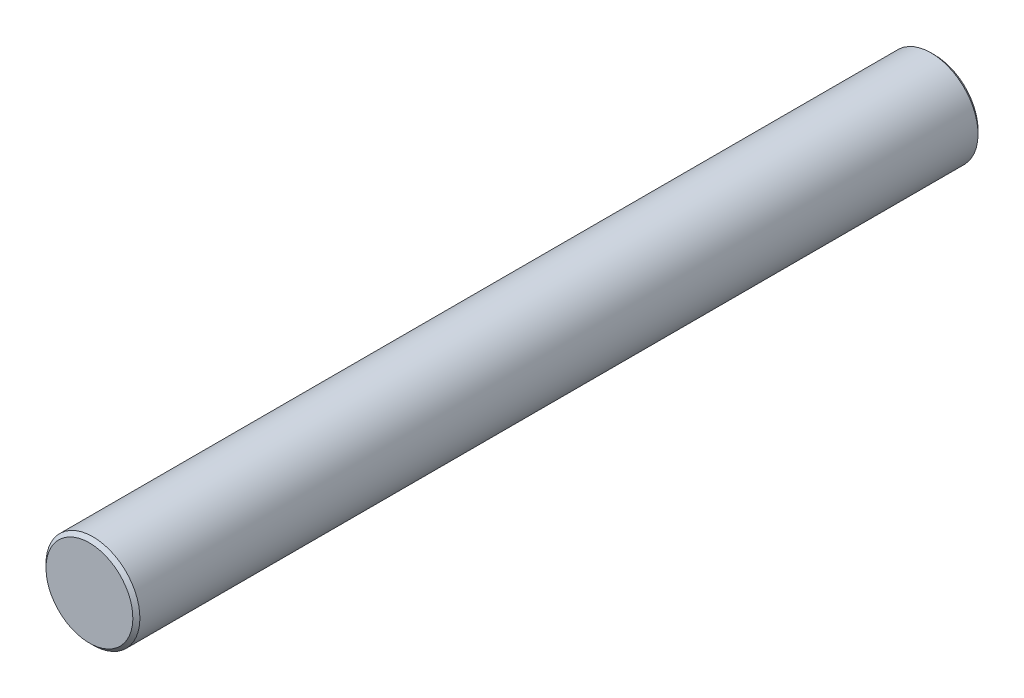
ISO-10303-21;
HEADER;
FILE_DESCRIPTION(('STEP AP214'),'2;1');
FILE_NAME('part.step','',(''),(''),'','','');
FILE_SCHEMA(('AUTOMOTIVE_DESIGN { 1 0 10303 214 1 1 1 1 }'));
ENDSEC;
DATA;
#1=APPLICATION_CONTEXT('core data for automotive mechanical design processes');
#2=APPLICATION_PROTOCOL_DEFINITION('international standard','automotive_design',2000,#1);
#3=PRODUCT_CONTEXT('',#1,'mechanical');
#4=PRODUCT('Part','Part','',(#3));
#5=PRODUCT_RELATED_PRODUCT_CATEGORY('part','',(#4));
#6=PRODUCT_DEFINITION_FORMATION('','',#4);
#7=PRODUCT_DEFINITION_CONTEXT('part definition',#1,'design');
#8=PRODUCT_DEFINITION('design','',#6,#7);
#9=PRODUCT_DEFINITION_SHAPE('','',#8);
#10=(LENGTH_UNIT() NAMED_UNIT(*) SI_UNIT(.MILLI.,.METRE.));
#11=(NAMED_UNIT(*) PLANE_ANGLE_UNIT() SI_UNIT($,.RADIAN.));
#12=(NAMED_UNIT(*) SI_UNIT($,.STERADIAN.) SOLID_ANGLE_UNIT());
#13=UNCERTAINTY_MEASURE_WITH_UNIT(LENGTH_MEASURE(1.E-05),#10,'distance_accuracy_value','');
#14=(GEOMETRIC_REPRESENTATION_CONTEXT(3) GLOBAL_UNCERTAINTY_ASSIGNED_CONTEXT((#13)) GLOBAL_UNIT_ASSIGNED_CONTEXT((#10,
#11,#12)) REPRESENTATION_CONTEXT('',''));
#15=CARTESIAN_POINT('',(0.,0.,0.));
#16=DIRECTION('',(0.,0.,1.));
#17=DIRECTION('',(1.,0.,0.));
#18=AXIS2_PLACEMENT_3D('',#15,#16,#17);
#19=CARTESIAN_POINT('',(0.,9.25,0.));
#20=DIRECTION('',(0.,0.,-1.));
#21=DIRECTION('',(0.,1.,0.));
#22=AXIS2_PLACEMENT_3D('',#19,#20,#21);
#23=PLANE('',#22);
#24=CARTESIAN_POINT('',(0.,0.,0.));
#25=DIRECTION('',(0.,0.,-1.));
#26=DIRECTION('',(0.,1.,0.));
#27=AXIS2_PLACEMENT_3D('',#24,#25,#26);
#28=CIRCLE('',#27,18.5);
#29=CARTESIAN_POINT('',(0.,18.5,0.));
#30=VERTEX_POINT('',#29);
#31=EDGE_CURVE('E9',#30,#30,#28,.T.);
#32=ORIENTED_EDGE('',*,*,#31,.T.);
#33=EDGE_LOOP('',(#32));
#34=FACE_BOUND('',#33,.T.);
#35=CARTESIAN_POINT('',(0.,0.,0.));
#36=DIRECTION('',(0.,0.,1.));
#37=DIRECTION('',(-1.,0.,0.));
#38=AXIS2_PLACEMENT_3D('',#35,#36,#37);
#39=CIRCLE('',#38,6.);
#40=CARTESIAN_POINT('',(-6.,0.,0.));
#41=VERTEX_POINT('',#40);
#42=EDGE_CURVE('E52',#41,#41,#39,.T.);
#43=ORIENTED_EDGE('',*,*,#42,.T.);
#44=EDGE_LOOP('',(#43));
#45=FACE_BOUND('',#44,.T.);
#46=ADVANCED_FACE('F15',(#34,#45),#23,.T.);
#47=CARTESIAN_POINT('',(0.,0.,0.75));
#48=DIRECTION('',(0.,0.,1.));
#49=DIRECTION('',(0.,1.,0.));
#50=AXIS2_PLACEMENT_3D('',#47,#48,#49);
#51=CONICAL_SURFACE('',#50,19.25,0.785398163397448);
#52=CARTESIAN_POINT('',(0.,0.,1.5));
#53=DIRECTION('',(0.,0.,-1.));
#54=DIRECTION('',(0.,1.,0.));
#55=AXIS2_PLACEMENT_3D('',#52,#53,#54);
#56=CIRCLE('',#55,20.);
#57=CARTESIAN_POINT('',(0.,20.,1.5));
#58=VERTEX_POINT('',#57);
#59=EDGE_CURVE('E25',#58,#58,#56,.T.);
#60=ORIENTED_EDGE('',*,*,#59,.T.);
#61=EDGE_LOOP('',(#60));
#62=FACE_BOUND('',#61,.T.);
#63=ORIENTED_EDGE('',*,*,#31,.F.);
#64=EDGE_LOOP('',(#63));
#65=FACE_BOUND('',#64,.T.);
#66=ADVANCED_FACE('F121',(#62,#65),#51,.T.);
#67=CARTESIAN_POINT('',(0.,0.,180.));
#68=DIRECTION('',(0.,0.,1.));
#69=DIRECTION('',(0.,1.,0.));
#70=AXIS2_PLACEMENT_3D('',#67,#68,#69);
#71=CYLINDRICAL_SURFACE('',#70,20.);
#72=CARTESIAN_POINT('',(0.,0.,358.5));
#73=DIRECTION('',(0.,0.,-1.));
#74=DIRECTION('',(0.,1.,0.));
#75=AXIS2_PLACEMENT_3D('',#72,#73,#74);
#76=CIRCLE('',#75,20.);
#77=CARTESIAN_POINT('',(0.,20.,358.5));
#78=VERTEX_POINT('',#77);
#79=EDGE_CURVE('E19',#78,#78,#76,.T.);
#80=ORIENTED_EDGE('',*,*,#79,.T.);
#81=EDGE_LOOP('',(#80));
#82=FACE_BOUND('',#81,.T.);
#83=ORIENTED_EDGE('',*,*,#59,.F.);
#84=EDGE_LOOP('',(#83));
#85=FACE_BOUND('',#84,.T.);
#86=CARTESIAN_POINT('',(0.,0.,6.5));
#87=DIRECTION('',(0.,0.,-1.));
#88=DIRECTION('',(0.,1.,0.));
#89=AXIS2_PLACEMENT_3D('',#86,#87,#88);
#90=CIRCLE('',#89,20.);
#91=CARTESIAN_POINT('',(10.5356537528527,-17.,6.5));
#92=VERTEX_POINT('',#91);
#93=CARTESIAN_POINT('',(-10.5356537528527,-17.,6.5));
#94=VERTEX_POINT('',#93);
#95=EDGE_CURVE('E69',#92,#94,#90,.T.);
#96=ORIENTED_EDGE('',*,*,#95,.T.);
#97=DIRECTION('',(0.,0.,1.));
#98=VECTOR('',#97,1.);
#99=CARTESIAN_POINT('',(-10.5356537528527,-17.,8.25));
#100=LINE('',#99,#98);
#101=CARTESIAN_POINT('',(-10.5356537528527,-17.,10.));
#102=VERTEX_POINT('',#101);
#103=EDGE_CURVE('E62',#94,#102,#100,.T.);
#104=ORIENTED_EDGE('',*,*,#103,.T.);
#105=CARTESIAN_POINT('',(0.,0.,10.));
#106=DIRECTION('',(0.,0.,1.));
#107=DIRECTION('',(0.,1.,0.));
#108=AXIS2_PLACEMENT_3D('',#105,#106,#107);
#109=CIRCLE('',#108,20.);
#110=CARTESIAN_POINT('',(10.5356537528527,-17.,10.));
#111=VERTEX_POINT('',#110);
#112=EDGE_CURVE('E75',#102,#111,#109,.T.);
#113=ORIENTED_EDGE('',*,*,#112,.T.);
#114=DIRECTION('',(0.,0.,-1.));
#115=VECTOR('',#114,1.);
#116=CARTESIAN_POINT('',(10.5356537528527,-17.,8.25));
#117=LINE('',#116,#115);
#118=EDGE_CURVE('E60',#111,#92,#117,.T.);
#119=ORIENTED_EDGE('',*,*,#118,.T.);
#120=EDGE_LOOP('',(#96,#104,#113,#119));
#121=FACE_BOUND('',#120,.T.);
#122=ADVANCED_FACE('F17',(#82,#85,#121),#71,.T.);
#123=CARTESIAN_POINT('',(0.,0.,359.25));
#124=DIRECTION('',(0.,0.,-1.));
#125=DIRECTION('',(0.,1.,0.));
#126=AXIS2_PLACEMENT_3D('',#123,#124,#125);
#127=CONICAL_SURFACE('',#126,19.25,0.785398163397448);
#128=CARTESIAN_POINT('',(0.,0.,360.));
#129=DIRECTION('',(0.,0.,-1.));
#130=DIRECTION('',(0.,1.,0.));
#131=AXIS2_PLACEMENT_3D('',#128,#129,#130);
#132=CIRCLE('',#131,18.5);
#133=CARTESIAN_POINT('',(0.,18.5,360.));
#134=VERTEX_POINT('',#133);
#135=EDGE_CURVE('E44',#134,#134,#132,.T.);
#136=ORIENTED_EDGE('',*,*,#135,.T.);
#137=EDGE_LOOP('',(#136));
#138=FACE_BOUND('',#137,.T.);
#139=ORIENTED_EDGE('',*,*,#79,.F.);
#140=EDGE_LOOP('',(#139));
#141=FACE_BOUND('',#140,.T.);
#142=ADVANCED_FACE('F116',(#138,#141),#127,.T.);
#143=CARTESIAN_POINT('',(0.,9.25,360.));
#144=DIRECTION('',(0.,0.,1.));
#145=DIRECTION('',(0.,-1.,0.));
#146=AXIS2_PLACEMENT_3D('',#143,#144,#145);
#147=PLANE('',#146);
#148=ORIENTED_EDGE('',*,*,#135,.F.);
#149=EDGE_LOOP('',(#148));
#150=FACE_BOUND('',#149,.T.);
#151=ADVANCED_FACE('F110',(#150),#147,.T.);
#152=CARTESIAN_POINT('',(0.,0.,26.4586213285198));
#153=DIRECTION('',(0.,0.,-1.));
#154=DIRECTION('',(-1.,0.,0.));
#155=AXIS2_PLACEMENT_3D('',#152,#153,#154);
#156=CONICAL_SURFACE('',#155,2.52640625,1.0471975511966);
#157=CARTESIAN_POINT('',(0.,0.,25.));
#158=DIRECTION('',(0.,0.,1.));
#159=DIRECTION('',(-1.,0.,0.));
#160=AXIS2_PLACEMENT_3D('',#157,#158,#159);
#161=CIRCLE('',#160,5.0528125);
#162=CARTESIAN_POINT('',(-5.0528125,0.,25.));
#163=VERTEX_POINT('',#162);
#164=EDGE_CURVE('E51',#163,#163,#161,.T.);
#165=ORIENTED_EDGE('',*,*,#164,.F.);
#166=EDGE_LOOP('',(#165));
#167=FACE_BOUND('',#166,.T.);
#168=CARTESIAN_POINT('',(0.,0.,27.9172426570397));
#169=VERTEX_POINT('',#168);
#170=VERTEX_LOOP('',#169);
#171=FACE_BOUND('',#170,.T.);
#172=ADVANCED_FACE('F104',(#167,#171),#156,.F.);
#173=CARTESIAN_POINT('',(0.,0.,12.97359375));
#174=DIRECTION('',(0.,0.,-1.));
#175=DIRECTION('',(-1.,0.,0.));
#176=AXIS2_PLACEMENT_3D('',#173,#174,#175);
#177=CYLINDRICAL_SURFACE('',#176,5.0528125);
#178=CARTESIAN_POINT('',(0.,0.,0.9471875));
#179=DIRECTION('',(0.,0.,1.));
#180=DIRECTION('',(-1.,0.,0.));
#181=AXIS2_PLACEMENT_3D('',#178,#179,#180);
#182=CIRCLE('',#181,5.0528125);
#183=CARTESIAN_POINT('',(-5.0528125,0.,0.9471875));
#184=VERTEX_POINT('',#183);
#185=EDGE_CURVE('E57',#184,#184,#182,.T.);
#186=ORIENTED_EDGE('',*,*,#185,.F.);
#187=EDGE_LOOP('',(#186));
#188=FACE_BOUND('',#187,.T.);
#189=ORIENTED_EDGE('',*,*,#164,.T.);
#190=EDGE_LOOP('',(#189));
#191=FACE_BOUND('',#190,.T.);
#192=ADVANCED_FACE('F101',(#188,#191),#177,.F.);
#193=CARTESIAN_POINT('',(0.,0.,0.47359375));
#194=DIRECTION('',(0.,0.,-1.));
#195=DIRECTION('',(-1.,0.,0.));
#196=AXIS2_PLACEMENT_3D('',#193,#194,#195);
#197=CONICAL_SURFACE('',#196,5.52640625,0.785398163397448);
#198=ORIENTED_EDGE('',*,*,#42,.F.);
#199=EDGE_LOOP('',(#198));
#200=FACE_BOUND('',#199,.T.);
#201=ORIENTED_EDGE('',*,*,#185,.T.);
#202=EDGE_LOOP('',(#201));
#203=FACE_BOUND('',#202,.T.);
#204=ADVANCED_FACE('F99',(#200,#203),#197,.F.);
#205=CARTESIAN_POINT('',(0.,-17.,8.25));
#206=DIRECTION('',(0.,-1.,0.));
#207=DIRECTION('',(0.,0.,-1.));
#208=AXIS2_PLACEMENT_3D('',#205,#206,#207);
#209=PLANE('',#208);
#210=ORIENTED_EDGE('',*,*,#103,.F.);
#211=DIRECTION('',(1.,0.,0.));
#212=VECTOR('',#211,1.);
#213=CARTESIAN_POINT('',(0.,-17.,6.5));
#214=LINE('',#213,#212);
#215=EDGE_CURVE('E66',#94,#92,#214,.T.);
#216=ORIENTED_EDGE('',*,*,#215,.T.);
#217=ORIENTED_EDGE('',*,*,#118,.F.);
#218=DIRECTION('',(-1.,0.,0.));
#219=VECTOR('',#218,1.);
#220=CARTESIAN_POINT('',(0.,-17.,10.));
#221=LINE('',#220,#219);
#222=EDGE_CURVE('E72',#111,#102,#221,.T.);
#223=ORIENTED_EDGE('',*,*,#222,.T.);
#224=EDGE_LOOP('',(#210,#216,#217,#223));
#225=FACE_BOUND('',#224,.T.);
#226=ADVANCED_FACE('F131',(#225),#209,.T.);
#227=CARTESIAN_POINT('',(0.,-19.5,6.5));
#228=DIRECTION('',(0.,0.,1.));
#229=DIRECTION('',(1.,0.,0.));
#230=AXIS2_PLACEMENT_3D('',#227,#228,#229);
#231=PLANE('',#230);
#232=ORIENTED_EDGE('',*,*,#95,.F.);
#233=ORIENTED_EDGE('',*,*,#215,.F.);
#234=EDGE_LOOP('',(#232,#233));
#235=FACE_BOUND('',#234,.T.);
#236=ADVANCED_FACE('F135',(#235),#231,.T.);
#237=CARTESIAN_POINT('',(0.,-19.5,10.));
#238=DIRECTION('',(0.,0.,1.));
#239=DIRECTION('',(1.,0.,0.));
#240=AXIS2_PLACEMENT_3D('',#237,#238,#239);
#241=PLANE('',#240);
#242=ORIENTED_EDGE('',*,*,#112,.F.);
#243=ORIENTED_EDGE('',*,*,#222,.F.);
#244=EDGE_LOOP('',(#242,#243));
#245=FACE_BOUND('',#244,.T.);
#246=ADVANCED_FACE('F87',(#245),#241,.F.);
#247=CLOSED_SHELL('',(#46,#66,#122,#142,#151,#172,#192,#204,#226,#236,#246));
#248=MANIFOLD_SOLID_BREP('B1',#247);
#249=ADVANCED_BREP_SHAPE_REPRESENTATION('',(#18,#248),#14);
#250=SHAPE_DEFINITION_REPRESENTATION(#9,#249);
ENDSEC;
END-ISO-10303-21;
